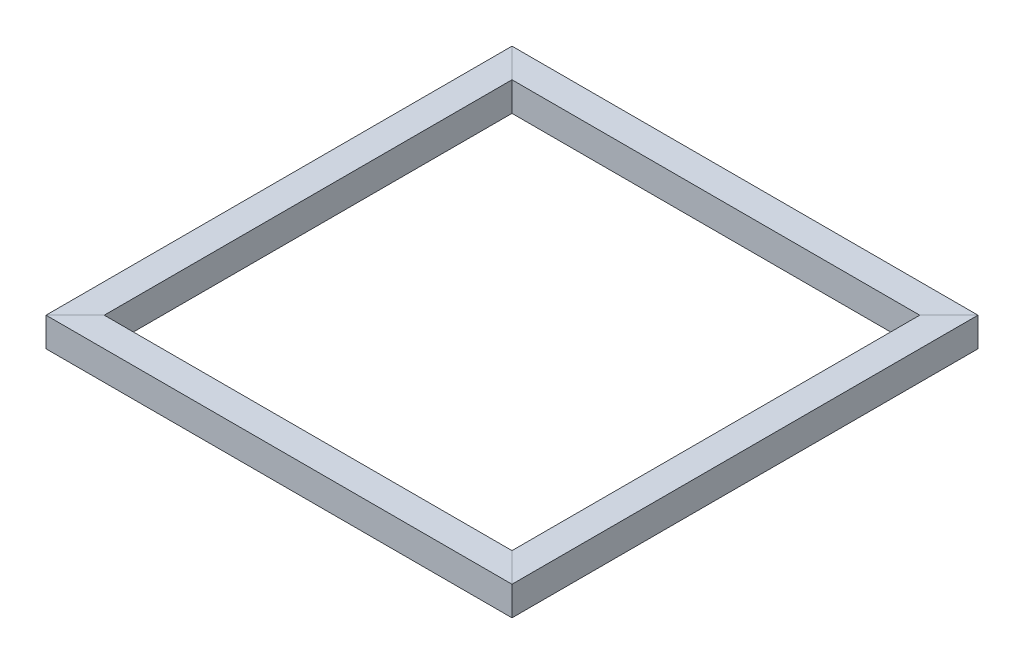
ISO-10303-21;
HEADER;
FILE_DESCRIPTION(('STEP AP214'),'2;1');
FILE_NAME('part.step','',(''),(''),'','','');
FILE_SCHEMA(('AUTOMOTIVE_DESIGN { 1 0 10303 214 1 1 1 1 }'));
ENDSEC;
DATA;
#1=APPLICATION_CONTEXT('core data for automotive mechanical design processes');
#2=APPLICATION_PROTOCOL_DEFINITION('international standard','automotive_design',2000,#1);
#3=PRODUCT_CONTEXT('',#1,'mechanical');
#4=PRODUCT('Part','Part','',(#3));
#5=PRODUCT_RELATED_PRODUCT_CATEGORY('part','',(#4));
#6=PRODUCT_DEFINITION_FORMATION('','',#4);
#7=PRODUCT_DEFINITION_CONTEXT('part definition',#1,'design');
#8=PRODUCT_DEFINITION('design','',#6,#7);
#9=PRODUCT_DEFINITION_SHAPE('','',#8);
#10=(LENGTH_UNIT() NAMED_UNIT(*) SI_UNIT(.MILLI.,.METRE.));
#11=(NAMED_UNIT(*) PLANE_ANGLE_UNIT() SI_UNIT($,.RADIAN.));
#12=(NAMED_UNIT(*) SI_UNIT($,.STERADIAN.) SOLID_ANGLE_UNIT());
#13=UNCERTAINTY_MEASURE_WITH_UNIT(LENGTH_MEASURE(1.E-05),#10,'distance_accuracy_value','');
#14=(GEOMETRIC_REPRESENTATION_CONTEXT(3) GLOBAL_UNCERTAINTY_ASSIGNED_CONTEXT((#13)) GLOBAL_UNIT_ASSIGNED_CONTEXT((#10,
#11,#12)) REPRESENTATION_CONTEXT('',''));
#15=CARTESIAN_POINT('',(0.,0.,0.));
#16=DIRECTION('',(0.,0.,1.));
#17=DIRECTION('',(1.,0.,0.));
#18=AXIS2_PLACEMENT_3D('',#15,#16,#17);
#19=CARTESIAN_POINT('',(-160.,10.,150.));
#20=DIRECTION('',(1.,0.,0.));
#21=DIRECTION('',(0.,0.,-1.));
#22=AXIS2_PLACEMENT_3D('',#19,#20,#21);
#23=PLANE('',#22);
#24=DIRECTION('',(0.,1.,0.));
#25=VECTOR('',#24,1.);
#26=CARTESIAN_POINT('',(-160.,10.,-160.));
#27=LINE('',#26,#25);
#28=CARTESIAN_POINT('',(-160.,-10.,-160.));
#29=VERTEX_POINT('',#28);
#30=CARTESIAN_POINT('',(-160.,10.,-160.));
#31=VERTEX_POINT('',#30);
#32=EDGE_CURVE('E141',#29,#31,#27,.T.);
#33=ORIENTED_EDGE('',*,*,#32,.F.);
#34=DIRECTION('',(0.,0.,-1.));
#35=VECTOR('',#34,1.);
#36=CARTESIAN_POINT('',(-160.,-10.,150.));
#37=LINE('',#36,#35);
#38=CARTESIAN_POINT('',(-160.,-10.,160.));
#39=VERTEX_POINT('',#38);
#40=EDGE_CURVE('E78',#39,#29,#37,.T.);
#41=ORIENTED_EDGE('',*,*,#40,.F.);
#42=DIRECTION('',(0.,-1.,0.));
#43=VECTOR('',#42,1.);
#44=CARTESIAN_POINT('',(-160.,10.,160.));
#45=LINE('',#44,#43);
#46=CARTESIAN_POINT('',(-160.,10.,160.));
#47=VERTEX_POINT('',#46);
#48=EDGE_CURVE('E153',#47,#39,#45,.T.);
#49=ORIENTED_EDGE('',*,*,#48,.F.);
#50=DIRECTION('',(0.,0.,-1.));
#51=VECTOR('',#50,1.);
#52=CARTESIAN_POINT('',(-160.,10.,150.));
#53=LINE('',#52,#51);
#54=EDGE_CURVE('E160',#47,#31,#53,.T.);
#55=ORIENTED_EDGE('',*,*,#54,.T.);
#56=EDGE_LOOP('',(#33,#41,#49,#55));
#57=FACE_BOUND('',#56,.T.);
#58=ADVANCED_FACE('F64',(#57),#23,.F.);
#59=CARTESIAN_POINT('',(-140.,-10.,150.));
#60=DIRECTION('',(0.,1.,0.));
#61=DIRECTION('',(-1.,0.,0.));
#62=AXIS2_PLACEMENT_3D('',#59,#60,#61);
#63=PLANE('',#62);
#64=DIRECTION('',(-0.707106781186547,0.,-0.707106781186548));
#65=VECTOR('',#64,1.);
#66=CARTESIAN_POINT('',(4.99999999999987,-9.99999999999997,5.00000000000003));
#67=LINE('',#66,#65);
#68=CARTESIAN_POINT('',(-140.,-10.,-140.));
#69=VERTEX_POINT('',#68);
#70=EDGE_CURVE('E183',#69,#29,#67,.T.);
#71=ORIENTED_EDGE('',*,*,#70,.F.);
#72=DIRECTION('',(0.,0.,-1.));
#73=VECTOR('',#72,1.);
#74=CARTESIAN_POINT('',(-140.,-10.,150.));
#75=LINE('',#74,#73);
#76=CARTESIAN_POINT('',(-140.,-10.,140.));
#77=VERTEX_POINT('',#76);
#78=EDGE_CURVE('E150',#77,#69,#75,.T.);
#79=ORIENTED_EDGE('',*,*,#78,.F.);
#80=DIRECTION('',(0.707106781186548,0.,-0.707106781186547));
#81=VECTOR('',#80,1.);
#82=CARTESIAN_POINT('',(-145.,-10.,145.));
#83=LINE('',#82,#81);
#84=EDGE_CURVE('E198',#39,#77,#83,.T.);
#85=ORIENTED_EDGE('',*,*,#84,.F.);
#86=ORIENTED_EDGE('',*,*,#40,.T.);
#87=EDGE_LOOP('',(#71,#79,#85,#86));
#88=FACE_BOUND('',#87,.T.);
#89=ADVANCED_FACE('F206',(#88),#63,.F.);
#90=CARTESIAN_POINT('',(-140.,10.,150.));
#91=DIRECTION('',(-1.,0.,0.));
#92=DIRECTION('',(0.,0.,1.));
#93=AXIS2_PLACEMENT_3D('',#90,#91,#92);
#94=PLANE('',#93);
#95=DIRECTION('',(0.,-1.,0.));
#96=VECTOR('',#95,1.);
#97=CARTESIAN_POINT('',(-140.,10.,-140.));
#98=LINE('',#97,#96);
#99=CARTESIAN_POINT('',(-140.,10.,-140.));
#100=VERTEX_POINT('',#99);
#101=EDGE_CURVE('E186',#100,#69,#98,.T.);
#102=ORIENTED_EDGE('',*,*,#101,.F.);
#103=DIRECTION('',(0.,0.,-1.));
#104=VECTOR('',#103,1.);
#105=CARTESIAN_POINT('',(-140.,10.,150.));
#106=LINE('',#105,#104);
#107=CARTESIAN_POINT('',(-140.,10.,140.));
#108=VERTEX_POINT('',#107);
#109=EDGE_CURVE('E162',#108,#100,#106,.T.);
#110=ORIENTED_EDGE('',*,*,#109,.F.);
#111=DIRECTION('',(0.,1.,0.));
#112=VECTOR('',#111,1.);
#113=CARTESIAN_POINT('',(-140.,10.,140.));
#114=LINE('',#113,#112);
#115=EDGE_CURVE('E196',#77,#108,#114,.T.);
#116=ORIENTED_EDGE('',*,*,#115,.F.);
#117=ORIENTED_EDGE('',*,*,#78,.T.);
#118=EDGE_LOOP('',(#102,#110,#116,#117));
#119=FACE_BOUND('',#118,.T.);
#120=ADVANCED_FACE('F208',(#119),#94,.F.);
#121=CARTESIAN_POINT('',(-140.,10.,150.));
#122=DIRECTION('',(0.,-1.,0.));
#123=DIRECTION('',(1.,0.,0.));
#124=AXIS2_PLACEMENT_3D('',#121,#122,#123);
#125=PLANE('',#124);
#126=DIRECTION('',(0.707106781186547,0.,0.707106781186548));
#127=VECTOR('',#126,1.);
#128=CARTESIAN_POINT('',(4.99999999999995,10.,5.00000000000003));
#129=LINE('',#128,#127);
#130=EDGE_CURVE('E175',#31,#100,#129,.T.);
#131=ORIENTED_EDGE('',*,*,#130,.F.);
#132=ORIENTED_EDGE('',*,*,#54,.F.);
#133=DIRECTION('',(-0.707106781186548,0.,0.707106781186547));
#134=VECTOR('',#133,1.);
#135=CARTESIAN_POINT('',(-145.,10.,145.));
#136=LINE('',#135,#134);
#137=EDGE_CURVE('E193',#108,#47,#136,.T.);
#138=ORIENTED_EDGE('',*,*,#137,.F.);
#139=ORIENTED_EDGE('',*,*,#109,.T.);
#140=EDGE_LOOP('',(#131,#132,#138,#139));
#141=FACE_BOUND('',#140,.T.);
#142=ADVANCED_FACE('F210',(#141),#125,.F.);
#143=CARTESIAN_POINT('',(-150.,0.,150.));
#144=DIRECTION('',(0.707106781186547,0.,0.707106781186548));
#145=DIRECTION('',(0.707106781186548,0.,-0.707106781186547));
#146=AXIS2_PLACEMENT_3D('',#143,#144,#145);
#147=PLANE('',#146);
#148=DIRECTION('',(0.,1.,0.));
#149=VECTOR('',#148,1.);
#150=CARTESIAN_POINT('',(-142.,8.,142.));
#151=LINE('',#150,#149);
#152=CARTESIAN_POINT('',(-142.,-8.,142.));
#153=VERTEX_POINT('',#152);
#154=CARTESIAN_POINT('',(-142.,8.,142.));
#155=VERTEX_POINT('',#154);
#156=EDGE_CURVE('E146',#153,#155,#151,.T.);
#157=ORIENTED_EDGE('',*,*,#156,.F.);
#158=DIRECTION('',(0.707106781186548,0.,-0.707106781186547));
#159=VECTOR('',#158,1.);
#160=CARTESIAN_POINT('',(-154.,-8.,154.));
#161=LINE('',#160,#159);
#162=CARTESIAN_POINT('',(-158.,-8.,158.));
#163=VERTEX_POINT('',#162);
#164=EDGE_CURVE('E172',#163,#153,#161,.T.);
#165=ORIENTED_EDGE('',*,*,#164,.F.);
#166=DIRECTION('',(0.,-1.,0.));
#167=VECTOR('',#166,1.);
#168=CARTESIAN_POINT('',(-158.,8.,158.));
#169=LINE('',#168,#167);
#170=CARTESIAN_POINT('',(-158.,8.,158.));
#171=VERTEX_POINT('',#170);
#172=EDGE_CURVE('E170',#171,#163,#169,.T.);
#173=ORIENTED_EDGE('',*,*,#172,.F.);
#174=DIRECTION('',(-0.707106781186548,0.,0.707106781186547));
#175=VECTOR('',#174,1.);
#176=CARTESIAN_POINT('',(-154.,8.,154.));
#177=LINE('',#176,#175);
#178=EDGE_CURVE('E71',#155,#171,#177,.T.);
#179=ORIENTED_EDGE('',*,*,#178,.F.);
#180=EDGE_LOOP('',(#157,#165,#173,#179));
#181=FACE_BOUND('',#180,.T.);
#182=ORIENTED_EDGE('',*,*,#137,.T.);
#183=ORIENTED_EDGE('',*,*,#48,.T.);
#184=ORIENTED_EDGE('',*,*,#84,.T.);
#185=ORIENTED_EDGE('',*,*,#115,.T.);
#186=EDGE_LOOP('',(#182,#183,#184,#185));
#187=FACE_BOUND('',#186,.T.);
#188=ADVANCED_FACE('F167',(#181,#187),#147,.T.);
#189=CARTESIAN_POINT('',(-142.,8.,150.));
#190=DIRECTION('',(-1.,0.,0.));
#191=DIRECTION('',(0.,0.,1.));
#192=AXIS2_PLACEMENT_3D('',#189,#190,#191);
#193=PLANE('',#192);
#194=DIRECTION('',(0.,0.,-1.));
#195=VECTOR('',#194,1.);
#196=CARTESIAN_POINT('',(-142.,8.,150.));
#197=LINE('',#196,#195);
#198=CARTESIAN_POINT('',(-142.,8.,-142.));
#199=VERTEX_POINT('',#198);
#200=EDGE_CURVE('E137',#155,#199,#197,.T.);
#201=ORIENTED_EDGE('',*,*,#200,.T.);
#202=DIRECTION('',(0.,-1.,0.));
#203=VECTOR('',#202,1.);
#204=CARTESIAN_POINT('',(-142.,8.,-142.));
#205=LINE('',#204,#203);
#206=CARTESIAN_POINT('',(-142.,-8.,-142.));
#207=VERTEX_POINT('',#206);
#208=EDGE_CURVE('E13',#199,#207,#205,.T.);
#209=ORIENTED_EDGE('',*,*,#208,.T.);
#210=DIRECTION('',(0.,0.,-1.));
#211=VECTOR('',#210,1.);
#212=CARTESIAN_POINT('',(-142.,-8.,150.));
#213=LINE('',#212,#211);
#214=EDGE_CURVE('E158',#153,#207,#213,.T.);
#215=ORIENTED_EDGE('',*,*,#214,.F.);
#216=ORIENTED_EDGE('',*,*,#156,.T.);
#217=EDGE_LOOP('',(#201,#209,#215,#216));
#218=FACE_BOUND('',#217,.T.);
#219=ADVANCED_FACE('F145',(#218),#193,.T.);
#220=CARTESIAN_POINT('',(-158.,-8.,150.));
#221=DIRECTION('',(0.,1.,0.));
#222=DIRECTION('',(0.,0.,1.));
#223=AXIS2_PLACEMENT_3D('',#220,#221,#222);
#224=PLANE('',#223);
#225=ORIENTED_EDGE('',*,*,#214,.T.);
#226=DIRECTION('',(-0.707106781186547,0.,-0.707106781186548));
#227=VECTOR('',#226,1.);
#228=CARTESIAN_POINT('',(-4.00000000000006,-8.,-4.));
#229=LINE('',#228,#227);
#230=CARTESIAN_POINT('',(-158.,-8.,-158.));
#231=VERTEX_POINT('',#230);
#232=EDGE_CURVE('E86',#207,#231,#229,.T.);
#233=ORIENTED_EDGE('',*,*,#232,.T.);
#234=DIRECTION('',(0.,0.,-1.));
#235=VECTOR('',#234,1.);
#236=CARTESIAN_POINT('',(-158.,-8.,150.));
#237=LINE('',#236,#235);
#238=EDGE_CURVE('E148',#163,#231,#237,.T.);
#239=ORIENTED_EDGE('',*,*,#238,.F.);
#240=ORIENTED_EDGE('',*,*,#164,.T.);
#241=EDGE_LOOP('',(#225,#233,#239,#240));
#242=FACE_BOUND('',#241,.T.);
#243=ADVANCED_FACE('F252',(#242),#224,.T.);
#244=CARTESIAN_POINT('',(-158.,8.,150.));
#245=DIRECTION('',(1.,0.,0.));
#246=DIRECTION('',(0.,0.,-1.));
#247=AXIS2_PLACEMENT_3D('',#244,#245,#246);
#248=PLANE('',#247);
#249=ORIENTED_EDGE('',*,*,#238,.T.);
#250=DIRECTION('',(0.,1.,0.));
#251=VECTOR('',#250,1.);
#252=CARTESIAN_POINT('',(-158.,8.,-158.));
#253=LINE('',#252,#251);
#254=CARTESIAN_POINT('',(-158.,8.,-158.));
#255=VERTEX_POINT('',#254);
#256=EDGE_CURVE('E142',#231,#255,#253,.T.);
#257=ORIENTED_EDGE('',*,*,#256,.T.);
#258=DIRECTION('',(0.,0.,-1.));
#259=VECTOR('',#258,1.);
#260=CARTESIAN_POINT('',(-158.,8.,150.));
#261=LINE('',#260,#259);
#262=EDGE_CURVE('E139',#171,#255,#261,.T.);
#263=ORIENTED_EDGE('',*,*,#262,.F.);
#264=ORIENTED_EDGE('',*,*,#172,.T.);
#265=EDGE_LOOP('',(#249,#257,#263,#264));
#266=FACE_BOUND('',#265,.T.);
#267=ADVANCED_FACE('F177',(#266),#248,.T.);
#268=CARTESIAN_POINT('',(-158.,8.,150.));
#269=DIRECTION('',(0.,-1.,0.));
#270=DIRECTION('',(0.,0.,-1.));
#271=AXIS2_PLACEMENT_3D('',#268,#269,#270);
#272=PLANE('',#271);
#273=ORIENTED_EDGE('',*,*,#262,.T.);
#274=DIRECTION('',(0.707106781186547,0.,0.707106781186548));
#275=VECTOR('',#274,1.);
#276=CARTESIAN_POINT('',(-4.00000000000006,8.,-4.));
#277=LINE('',#276,#275);
#278=EDGE_CURVE('E128',#255,#199,#277,.T.);
#279=ORIENTED_EDGE('',*,*,#278,.T.);
#280=ORIENTED_EDGE('',*,*,#200,.F.);
#281=ORIENTED_EDGE('',*,*,#178,.T.);
#282=EDGE_LOOP('',(#273,#279,#280,#281));
#283=FACE_BOUND('',#282,.T.);
#284=ADVANCED_FACE('F135',(#283),#272,.T.);
#285=CARTESIAN_POINT('',(-150.,0.,-150.));
#286=DIRECTION('',(0.707106781186548,0.,-0.707106781186547));
#287=DIRECTION('',(-0.707106781186547,0.,-0.707106781186548));
#288=AXIS2_PLACEMENT_3D('',#285,#286,#287);
#289=PLANE('',#288);
#290=ORIENTED_EDGE('',*,*,#278,.F.);
#291=ORIENTED_EDGE('',*,*,#256,.F.);
#292=ORIENTED_EDGE('',*,*,#232,.F.);
#293=ORIENTED_EDGE('',*,*,#208,.F.);
#294=EDGE_LOOP('',(#290,#291,#292,#293));
#295=FACE_BOUND('',#294,.T.);
#296=ORIENTED_EDGE('',*,*,#32,.T.);
#297=ORIENTED_EDGE('',*,*,#130,.T.);
#298=ORIENTED_EDGE('',*,*,#101,.T.);
#299=ORIENTED_EDGE('',*,*,#70,.T.);
#300=EDGE_LOOP('',(#296,#297,#298,#299));
#301=FACE_BOUND('',#300,.T.);
#302=ADVANCED_FACE('F126',(#295,#301),#289,.T.);
#303=CLOSED_SHELL('',(#58,#89,#120,#142,#188,#219,#243,#267,#284,#302));
#304=MANIFOLD_SOLID_BREP('B2',#303);
#305=CARTESIAN_POINT('',(-150.,10.,-160.));
#306=DIRECTION('',(0.,0.,1.));
#307=DIRECTION('',(1.,0.,0.));
#308=AXIS2_PLACEMENT_3D('',#305,#306,#307);
#309=PLANE('',#308);
#310=DIRECTION('',(0.,-1.,0.));
#311=VECTOR('',#310,1.);
#312=CARTESIAN_POINT('',(-160.,10.,-160.));
#313=LINE('',#312,#311);
#314=CARTESIAN_POINT('',(-160.,10.,-160.));
#315=VERTEX_POINT('',#314);
#316=CARTESIAN_POINT('',(-160.,-10.,-160.));
#317=VERTEX_POINT('',#316);
#318=EDGE_CURVE('E467',#315,#317,#313,.T.);
#319=ORIENTED_EDGE('',*,*,#318,.F.);
#320=DIRECTION('',(1.,0.,0.));
#321=VECTOR('',#320,1.);
#322=CARTESIAN_POINT('',(-150.,10.,-160.));
#323=LINE('',#322,#321);
#324=CARTESIAN_POINT('',(160.,10.,-160.));
#325=VERTEX_POINT('',#324);
#326=EDGE_CURVE('E354',#315,#325,#323,.T.);
#327=ORIENTED_EDGE('',*,*,#326,.T.);
#328=DIRECTION('',(0.,1.,0.));
#329=VECTOR('',#328,1.);
#330=CARTESIAN_POINT('',(160.,10.,-160.));
#331=LINE('',#330,#329);
#332=CARTESIAN_POINT('',(160.,-10.,-160.));
#333=VERTEX_POINT('',#332);
#334=EDGE_CURVE('E429',#333,#325,#331,.T.);
#335=ORIENTED_EDGE('',*,*,#334,.F.);
#336=DIRECTION('',(1.,0.,0.));
#337=VECTOR('',#336,1.);
#338=CARTESIAN_POINT('',(-150.,-10.,-160.));
#339=LINE('',#338,#337);
#340=EDGE_CURVE('E433',#317,#333,#339,.T.);
#341=ORIENTED_EDGE('',*,*,#340,.F.);
#342=EDGE_LOOP('',(#319,#327,#335,#341));
#343=FACE_BOUND('',#342,.T.);
#344=ADVANCED_FACE('F340',(#343),#309,.F.);
#345=CARTESIAN_POINT('',(-150.,-10.,-140.));
#346=DIRECTION('',(0.,1.,0.));
#347=DIRECTION('',(0.,0.,1.));
#348=AXIS2_PLACEMENT_3D('',#345,#346,#347);
#349=PLANE('',#348);
#350=DIRECTION('',(0.707106781186547,0.,0.707106781186548));
#351=VECTOR('',#350,1.);
#352=CARTESIAN_POINT('',(-145.,-10.,-145.));
#353=LINE('',#352,#351);
#354=CARTESIAN_POINT('',(-140.,-10.,-140.));
#355=VERTEX_POINT('',#354);
#356=EDGE_CURVE('E464',#317,#355,#353,.T.);
#357=ORIENTED_EDGE('',*,*,#356,.F.);
#358=ORIENTED_EDGE('',*,*,#340,.T.);
#359=DIRECTION('',(0.707106781186548,0.,-0.707106781186547));
#360=VECTOR('',#359,1.);
#361=CARTESIAN_POINT('',(-5.00000000000009,-9.99999999999998,4.99999999999981));
#362=LINE('',#361,#360);
#363=CARTESIAN_POINT('',(140.,-10.,-140.));
#364=VERTEX_POINT('',#363);
#365=EDGE_CURVE('E443',#364,#333,#362,.T.);
#366=ORIENTED_EDGE('',*,*,#365,.F.);
#367=DIRECTION('',(1.,0.,0.));
#368=VECTOR('',#367,1.);
#369=CARTESIAN_POINT('',(-150.,-10.,-140.));
#370=LINE('',#369,#368);
#371=EDGE_CURVE('E431',#355,#364,#370,.T.);
#372=ORIENTED_EDGE('',*,*,#371,.F.);
#373=EDGE_LOOP('',(#357,#358,#366,#372));
#374=FACE_BOUND('',#373,.T.);
#375=ADVANCED_FACE('F486',(#374),#349,.F.);
#376=CARTESIAN_POINT('',(-150.,10.,-140.));
#377=DIRECTION('',(0.,0.,-1.));
#378=DIRECTION('',(-1.,0.,0.));
#379=AXIS2_PLACEMENT_3D('',#376,#377,#378);
#380=PLANE('',#379);
#381=DIRECTION('',(0.,1.,0.));
#382=VECTOR('',#381,1.);
#383=CARTESIAN_POINT('',(-140.,10.,-140.));
#384=LINE('',#383,#382);
#385=CARTESIAN_POINT('',(-140.,10.,-140.));
#386=VERTEX_POINT('',#385);
#387=EDGE_CURVE('E461',#355,#386,#384,.T.);
#388=ORIENTED_EDGE('',*,*,#387,.F.);
#389=ORIENTED_EDGE('',*,*,#371,.T.);
#390=DIRECTION('',(0.,-1.,0.));
#391=VECTOR('',#390,1.);
#392=CARTESIAN_POINT('',(140.,10.,-140.));
#393=LINE('',#392,#391);
#394=CARTESIAN_POINT('',(140.,10.,-140.));
#395=VERTEX_POINT('',#394);
#396=EDGE_CURVE('E446',#395,#364,#393,.T.);
#397=ORIENTED_EDGE('',*,*,#396,.F.);
#398=DIRECTION('',(1.,0.,0.));
#399=VECTOR('',#398,1.);
#400=CARTESIAN_POINT('',(-150.,10.,-140.));
#401=LINE('',#400,#399);
#402=EDGE_CURVE('E428',#386,#395,#401,.T.);
#403=ORIENTED_EDGE('',*,*,#402,.F.);
#404=EDGE_LOOP('',(#388,#389,#397,#403));
#405=FACE_BOUND('',#404,.T.);
#406=ADVANCED_FACE('F490',(#405),#380,.F.);
#407=CARTESIAN_POINT('',(-150.,10.,-140.));
#408=DIRECTION('',(0.,-1.,0.));
#409=DIRECTION('',(0.,0.,-1.));
#410=AXIS2_PLACEMENT_3D('',#407,#408,#409);
#411=PLANE('',#410);
#412=DIRECTION('',(-0.707106781186547,0.,-0.707106781186548));
#413=VECTOR('',#412,1.);
#414=CARTESIAN_POINT('',(-145.,10.,-145.));
#415=LINE('',#414,#413);
#416=EDGE_CURVE('E458',#386,#315,#415,.T.);
#417=ORIENTED_EDGE('',*,*,#416,.F.);
#418=ORIENTED_EDGE('',*,*,#402,.T.);
#419=DIRECTION('',(-0.707106781186548,0.,0.707106781186547));
#420=VECTOR('',#419,1.);
#421=CARTESIAN_POINT('',(-5.00000000000009,10.,4.99999999999981));
#422=LINE('',#421,#420);
#423=EDGE_CURVE('E449',#325,#395,#422,.T.);
#424=ORIENTED_EDGE('',*,*,#423,.F.);
#425=ORIENTED_EDGE('',*,*,#326,.F.);
#426=EDGE_LOOP('',(#417,#418,#424,#425));
#427=FACE_BOUND('',#426,.T.);
#428=ADVANCED_FACE('F482',(#427),#411,.F.);
#429=CARTESIAN_POINT('',(150.,0.,-150.));
#430=DIRECTION('',(0.707106781186547,0.,0.707106781186548));
#431=DIRECTION('',(0.707106781186548,0.,-0.707106781186547));
#432=AXIS2_PLACEMENT_3D('',#429,#430,#431);
#433=PLANE('',#432);
#434=DIRECTION('',(0.,-1.,0.));
#435=VECTOR('',#434,1.);
#436=CARTESIAN_POINT('',(142.,8.,-142.));
#437=LINE('',#436,#435);
#438=CARTESIAN_POINT('',(142.,8.,-142.));
#439=VERTEX_POINT('',#438);
#440=CARTESIAN_POINT('',(142.,-8.,-142.));
#441=VERTEX_POINT('',#440);
#442=EDGE_CURVE('E420',#439,#441,#437,.T.);
#443=ORIENTED_EDGE('',*,*,#442,.F.);
#444=DIRECTION('',(-0.707106781186548,0.,0.707106781186547));
#445=VECTOR('',#444,1.);
#446=CARTESIAN_POINT('',(3.99999999999992,8.,-4.00000000000017));
#447=LINE('',#446,#445);
#448=CARTESIAN_POINT('',(158.,8.,-158.));
#449=VERTEX_POINT('',#448);
#450=EDGE_CURVE('E347',#449,#439,#447,.T.);
#451=ORIENTED_EDGE('',*,*,#450,.F.);
#452=DIRECTION('',(0.,1.,0.));
#453=VECTOR('',#452,1.);
#454=CARTESIAN_POINT('',(158.,8.,-158.));
#455=LINE('',#454,#453);
#456=CARTESIAN_POINT('',(158.,-8.,-158.));
#457=VERTEX_POINT('',#456);
#458=EDGE_CURVE('E455',#457,#449,#455,.T.);
#459=ORIENTED_EDGE('',*,*,#458,.F.);
#460=DIRECTION('',(0.707106781186548,0.,-0.707106781186547));
#461=VECTOR('',#460,1.);
#462=CARTESIAN_POINT('',(3.99999999999992,-8.,-4.00000000000017));
#463=LINE('',#462,#461);
#464=EDGE_CURVE('E453',#441,#457,#463,.T.);
#465=ORIENTED_EDGE('',*,*,#464,.F.);
#466=EDGE_LOOP('',(#443,#451,#459,#465));
#467=FACE_BOUND('',#466,.T.);
#468=ORIENTED_EDGE('',*,*,#365,.T.);
#469=ORIENTED_EDGE('',*,*,#334,.T.);
#470=ORIENTED_EDGE('',*,*,#423,.T.);
#471=ORIENTED_EDGE('',*,*,#396,.T.);
#472=EDGE_LOOP('',(#468,#469,#470,#471));
#473=FACE_BOUND('',#472,.T.);
#474=ADVANCED_FACE('F479',(#467,#473),#433,.T.);
#475=CARTESIAN_POINT('',(-150.,8.,-142.));
#476=DIRECTION('',(0.,0.,-1.));
#477=DIRECTION('',(-1.,0.,0.));
#478=AXIS2_PLACEMENT_3D('',#475,#476,#477);
#479=PLANE('',#478);
#480=DIRECTION('',(1.,0.,0.));
#481=VECTOR('',#480,1.);
#482=CARTESIAN_POINT('',(-150.,-8.,-142.));
#483=LINE('',#482,#481);
#484=CARTESIAN_POINT('',(-142.,-8.,-142.));
#485=VERTEX_POINT('',#484);
#486=EDGE_CURVE('E411',#485,#441,#483,.T.);
#487=ORIENTED_EDGE('',*,*,#486,.F.);
#488=DIRECTION('',(0.,1.,0.));
#489=VECTOR('',#488,1.);
#490=CARTESIAN_POINT('',(-142.,8.,-142.));
#491=LINE('',#490,#489);
#492=CARTESIAN_POINT('',(-142.,8.,-142.));
#493=VERTEX_POINT('',#492);
#494=EDGE_CURVE('E62',#485,#493,#491,.T.);
#495=ORIENTED_EDGE('',*,*,#494,.T.);
#496=DIRECTION('',(1.,0.,0.));
#497=VECTOR('',#496,1.);
#498=CARTESIAN_POINT('',(-150.,8.,-142.));
#499=LINE('',#498,#497);
#500=EDGE_CURVE('E434',#493,#439,#499,.T.);
#501=ORIENTED_EDGE('',*,*,#500,.T.);
#502=ORIENTED_EDGE('',*,*,#442,.T.);
#503=EDGE_LOOP('',(#487,#495,#501,#502));
#504=FACE_BOUND('',#503,.T.);
#505=ADVANCED_FACE('F418',(#504),#479,.T.);
#506=CARTESIAN_POINT('',(-150.,-8.,-158.));
#507=DIRECTION('',(0.,1.,0.));
#508=DIRECTION('',(0.,0.,1.));
#509=AXIS2_PLACEMENT_3D('',#506,#507,#508);
#510=PLANE('',#509);
#511=DIRECTION('',(1.,0.,0.));
#512=VECTOR('',#511,1.);
#513=CARTESIAN_POINT('',(-150.,-8.,-158.));
#514=LINE('',#513,#512);
#515=CARTESIAN_POINT('',(-158.,-8.,-158.));
#516=VERTEX_POINT('',#515);
#517=EDGE_CURVE('E413',#516,#457,#514,.T.);
#518=ORIENTED_EDGE('',*,*,#517,.F.);
#519=DIRECTION('',(0.707106781186547,0.,0.707106781186548));
#520=VECTOR('',#519,1.);
#521=CARTESIAN_POINT('',(-154.,-8.,-154.));
#522=LINE('',#521,#520);
#523=EDGE_CURVE('E404',#516,#485,#522,.T.);
#524=ORIENTED_EDGE('',*,*,#523,.T.);
#525=ORIENTED_EDGE('',*,*,#486,.T.);
#526=ORIENTED_EDGE('',*,*,#464,.T.);
#527=EDGE_LOOP('',(#518,#524,#525,#526));
#528=FACE_BOUND('',#527,.T.);
#529=ADVANCED_FACE('F409',(#528),#510,.T.);
#530=CARTESIAN_POINT('',(-150.,8.,-158.));
#531=DIRECTION('',(0.,0.,1.));
#532=DIRECTION('',(1.,0.,0.));
#533=AXIS2_PLACEMENT_3D('',#530,#531,#532);
#534=PLANE('',#533);
#535=DIRECTION('',(1.,0.,0.));
#536=VECTOR('',#535,1.);
#537=CARTESIAN_POINT('',(-150.,8.,-158.));
#538=LINE('',#537,#536);
#539=CARTESIAN_POINT('',(-158.,8.,-158.));
#540=VERTEX_POINT('',#539);
#541=EDGE_CURVE('E423',#540,#449,#538,.T.);
#542=ORIENTED_EDGE('',*,*,#541,.F.);
#543=DIRECTION('',(0.,-1.,0.));
#544=VECTOR('',#543,1.);
#545=CARTESIAN_POINT('',(-158.,8.,-158.));
#546=LINE('',#545,#544);
#547=EDGE_CURVE('E415',#540,#516,#546,.T.);
#548=ORIENTED_EDGE('',*,*,#547,.T.);
#549=ORIENTED_EDGE('',*,*,#517,.T.);
#550=ORIENTED_EDGE('',*,*,#458,.T.);
#551=EDGE_LOOP('',(#542,#548,#549,#550));
#552=FACE_BOUND('',#551,.T.);
#553=ADVANCED_FACE('F473',(#552),#534,.T.);
#554=CARTESIAN_POINT('',(-150.,8.,-158.));
#555=DIRECTION('',(0.,-1.,0.));
#556=DIRECTION('',(0.,0.,-1.));
#557=AXIS2_PLACEMENT_3D('',#554,#555,#556);
#558=PLANE('',#557);
#559=ORIENTED_EDGE('',*,*,#500,.F.);
#560=DIRECTION('',(-0.707106781186547,0.,-0.707106781186548));
#561=VECTOR('',#560,1.);
#562=CARTESIAN_POINT('',(-154.,8.,-154.));
#563=LINE('',#562,#561);
#564=EDGE_CURVE('E362',#493,#540,#563,.T.);
#565=ORIENTED_EDGE('',*,*,#564,.T.);
#566=ORIENTED_EDGE('',*,*,#541,.T.);
#567=ORIENTED_EDGE('',*,*,#450,.T.);
#568=EDGE_LOOP('',(#559,#565,#566,#567));
#569=FACE_BOUND('',#568,.T.);
#570=ADVANCED_FACE('F477',(#569),#558,.T.);
#571=CARTESIAN_POINT('',(-150.,0.,-150.));
#572=DIRECTION('',(-0.707106781186548,0.,0.707106781186547));
#573=DIRECTION('',(0.707106781186547,0.,0.707106781186548));
#574=AXIS2_PLACEMENT_3D('',#571,#572,#573);
#575=PLANE('',#574);
#576=ORIENTED_EDGE('',*,*,#564,.F.);
#577=ORIENTED_EDGE('',*,*,#494,.F.);
#578=ORIENTED_EDGE('',*,*,#523,.F.);
#579=ORIENTED_EDGE('',*,*,#547,.F.);
#580=EDGE_LOOP('',(#576,#577,#578,#579));
#581=FACE_BOUND('',#580,.T.);
#582=ORIENTED_EDGE('',*,*,#387,.T.);
#583=ORIENTED_EDGE('',*,*,#416,.T.);
#584=ORIENTED_EDGE('',*,*,#318,.T.);
#585=ORIENTED_EDGE('',*,*,#356,.T.);
#586=EDGE_LOOP('',(#582,#583,#584,#585));
#587=FACE_BOUND('',#586,.T.);
#588=ADVANCED_FACE('F402',(#581,#587),#575,.T.);
#589=CLOSED_SHELL('',(#344,#375,#406,#428,#474,#505,#529,#553,#570,#588));
#590=MANIFOLD_SOLID_BREP('B7',#589);
#591=CARTESIAN_POINT('',(150.,10.,160.));
#592=DIRECTION('',(0.,0.,-1.));
#593=DIRECTION('',(-1.,0.,0.));
#594=AXIS2_PLACEMENT_3D('',#591,#592,#593);
#595=PLANE('',#594);
#596=DIRECTION('',(0.,1.,0.));
#597=VECTOR('',#596,1.);
#598=CARTESIAN_POINT('',(-160.,10.,160.));
#599=LINE('',#598,#597);
#600=CARTESIAN_POINT('',(-160.,-10.,160.));
#601=VERTEX_POINT('',#600);
#602=CARTESIAN_POINT('',(-160.,10.,160.));
#603=VERTEX_POINT('',#602);
#604=EDGE_CURVE('E692',#601,#603,#599,.T.);
#605=ORIENTED_EDGE('',*,*,#604,.F.);
#606=DIRECTION('',(-1.,0.,0.));
#607=VECTOR('',#606,1.);
#608=CARTESIAN_POINT('',(150.,-10.,160.));
#609=LINE('',#608,#607);
#610=CARTESIAN_POINT('',(160.,-10.,160.));
#611=VERTEX_POINT('',#610);
#612=EDGE_CURVE('E629',#611,#601,#609,.T.);
#613=ORIENTED_EDGE('',*,*,#612,.F.);
#614=DIRECTION('',(0.,-1.,0.));
#615=VECTOR('',#614,1.);
#616=CARTESIAN_POINT('',(160.,10.,160.));
#617=LINE('',#616,#615);
#618=CARTESIAN_POINT('',(160.,10.,160.));
#619=VERTEX_POINT('',#618);
#620=EDGE_CURVE('E704',#619,#611,#617,.T.);
#621=ORIENTED_EDGE('',*,*,#620,.F.);
#622=DIRECTION('',(-1.,0.,0.));
#623=VECTOR('',#622,1.);
#624=CARTESIAN_POINT('',(150.,10.,160.));
#625=LINE('',#624,#623);
#626=EDGE_CURVE('E711',#619,#603,#625,.T.);
#627=ORIENTED_EDGE('',*,*,#626,.T.);
#628=EDGE_LOOP('',(#605,#613,#621,#627));
#629=FACE_BOUND('',#628,.T.);
#630=ADVANCED_FACE('F615',(#629),#595,.F.);
#631=CARTESIAN_POINT('',(150.,-10.,140.));
#632=DIRECTION('',(0.,1.,0.));
#633=DIRECTION('',(0.,0.,1.));
#634=AXIS2_PLACEMENT_3D('',#631,#632,#633);
#635=PLANE('',#634);
#636=DIRECTION('',(-0.707106781186548,0.,0.707106781186547));
#637=VECTOR('',#636,1.);
#638=CARTESIAN_POINT('',(4.99999999999989,-9.99999999999998,-5.));
#639=LINE('',#638,#637);
#640=CARTESIAN_POINT('',(-140.,-10.,140.));
#641=VERTEX_POINT('',#640);
#642=EDGE_CURVE('E734',#641,#601,#639,.T.);
#643=ORIENTED_EDGE('',*,*,#642,.F.);
#644=DIRECTION('',(-1.,0.,0.));
#645=VECTOR('',#644,1.);
#646=CARTESIAN_POINT('',(150.,-10.,140.));
#647=LINE('',#646,#645);
#648=CARTESIAN_POINT('',(140.,-10.,140.));
#649=VERTEX_POINT('',#648);
#650=EDGE_CURVE('E701',#649,#641,#647,.T.);
#651=ORIENTED_EDGE('',*,*,#650,.F.);
#652=DIRECTION('',(-0.707106781186547,0.,-0.707106781186548));
#653=VECTOR('',#652,1.);
#654=CARTESIAN_POINT('',(145.,-10.,145.));
#655=LINE('',#654,#653);
#656=EDGE_CURVE('E749',#611,#649,#655,.T.);
#657=ORIENTED_EDGE('',*,*,#656,.F.);
#658=ORIENTED_EDGE('',*,*,#612,.T.);
#659=EDGE_LOOP('',(#643,#651,#657,#658));
#660=FACE_BOUND('',#659,.T.);
#661=ADVANCED_FACE('F757',(#660),#635,.F.);
#662=CARTESIAN_POINT('',(150.,10.,140.));
#663=DIRECTION('',(0.,0.,1.));
#664=DIRECTION('',(1.,0.,0.));
#665=AXIS2_PLACEMENT_3D('',#662,#663,#664);
#666=PLANE('',#665);
#667=DIRECTION('',(0.,-1.,0.));
#668=VECTOR('',#667,1.);
#669=CARTESIAN_POINT('',(-140.,10.,140.));
#670=LINE('',#669,#668);
#671=CARTESIAN_POINT('',(-140.,10.,140.));
#672=VERTEX_POINT('',#671);
#673=EDGE_CURVE('E737',#672,#641,#670,.T.);
#674=ORIENTED_EDGE('',*,*,#673,.F.);
#675=DIRECTION('',(-1.,0.,0.));
#676=VECTOR('',#675,1.);
#677=CARTESIAN_POINT('',(150.,10.,140.));
#678=LINE('',#677,#676);
#679=CARTESIAN_POINT('',(140.,10.,140.));
#680=VERTEX_POINT('',#679);
#681=EDGE_CURVE('E713',#680,#672,#678,.T.);
#682=ORIENTED_EDGE('',*,*,#681,.F.);
#683=DIRECTION('',(0.,1.,0.));
#684=VECTOR('',#683,1.);
#685=CARTESIAN_POINT('',(140.,10.,140.));
#686=LINE('',#685,#684);
#687=EDGE_CURVE('E747',#649,#680,#686,.T.);
#688=ORIENTED_EDGE('',*,*,#687,.F.);
#689=ORIENTED_EDGE('',*,*,#650,.T.);
#690=EDGE_LOOP('',(#674,#682,#688,#689));
#691=FACE_BOUND('',#690,.T.);
#692=ADVANCED_FACE('F759',(#691),#666,.F.);
#693=CARTESIAN_POINT('',(150.,10.,140.));
#694=DIRECTION('',(0.,-1.,0.));
#695=DIRECTION('',(0.,0.,-1.));
#696=AXIS2_PLACEMENT_3D('',#693,#694,#695);
#697=PLANE('',#696);
#698=DIRECTION('',(0.707106781186548,0.,-0.707106781186547));
#699=VECTOR('',#698,1.);
#700=CARTESIAN_POINT('',(4.99999999999989,10.,-5.));
#701=LINE('',#700,#699);
#702=EDGE_CURVE('E726',#603,#672,#701,.T.);
#703=ORIENTED_EDGE('',*,*,#702,.F.);
#704=ORIENTED_EDGE('',*,*,#626,.F.);
#705=DIRECTION('',(0.707106781186547,0.,0.707106781186548));
#706=VECTOR('',#705,1.);
#707=CARTESIAN_POINT('',(145.,10.,145.));
#708=LINE('',#707,#706);
#709=EDGE_CURVE('E744',#680,#619,#708,.T.);
#710=ORIENTED_EDGE('',*,*,#709,.F.);
#711=ORIENTED_EDGE('',*,*,#681,.T.);
#712=EDGE_LOOP('',(#703,#704,#710,#711));
#713=FACE_BOUND('',#712,.T.);
#714=ADVANCED_FACE('F761',(#713),#697,.F.);
#715=CARTESIAN_POINT('',(150.,0.,150.));
#716=DIRECTION('',(0.707106781186548,0.,-0.707106781186547));
#717=DIRECTION('',(-0.707106781186547,0.,-0.707106781186548));
#718=AXIS2_PLACEMENT_3D('',#715,#716,#717);
#719=PLANE('',#718);
#720=DIRECTION('',(0.,1.,0.));
#721=VECTOR('',#720,1.);
#722=CARTESIAN_POINT('',(142.,8.,142.));
#723=LINE('',#722,#721);
#724=CARTESIAN_POINT('',(142.,-8.,142.));
#725=VERTEX_POINT('',#724);
#726=CARTESIAN_POINT('',(142.,8.,142.));
#727=VERTEX_POINT('',#726);
#728=EDGE_CURVE('E697',#725,#727,#723,.T.);
#729=ORIENTED_EDGE('',*,*,#728,.F.);
#730=DIRECTION('',(-0.707106781186547,0.,-0.707106781186548));
#731=VECTOR('',#730,1.);
#732=CARTESIAN_POINT('',(154.,-8.,154.));
#733=LINE('',#732,#731);
#734=CARTESIAN_POINT('',(158.,-8.,158.));
#735=VERTEX_POINT('',#734);
#736=EDGE_CURVE('E723',#735,#725,#733,.T.);
#737=ORIENTED_EDGE('',*,*,#736,.F.);
#738=DIRECTION('',(0.,-1.,0.));
#739=VECTOR('',#738,1.);
#740=CARTESIAN_POINT('',(158.,8.,158.));
#741=LINE('',#740,#739);
#742=CARTESIAN_POINT('',(158.,8.,158.));
#743=VERTEX_POINT('',#742);
#744=EDGE_CURVE('E721',#743,#735,#741,.T.);
#745=ORIENTED_EDGE('',*,*,#744,.F.);
#746=DIRECTION('',(0.707106781186547,0.,0.707106781186548));
#747=VECTOR('',#746,1.);
#748=CARTESIAN_POINT('',(154.,8.,154.));
#749=LINE('',#748,#747);
#750=EDGE_CURVE('E622',#727,#743,#749,.T.);
#751=ORIENTED_EDGE('',*,*,#750,.F.);
#752=EDGE_LOOP('',(#729,#737,#745,#751));
#753=FACE_BOUND('',#752,.T.);
#754=ORIENTED_EDGE('',*,*,#709,.T.);
#755=ORIENTED_EDGE('',*,*,#620,.T.);
#756=ORIENTED_EDGE('',*,*,#656,.T.);
#757=ORIENTED_EDGE('',*,*,#687,.T.);
#758=EDGE_LOOP('',(#754,#755,#756,#757));
#759=FACE_BOUND('',#758,.T.);
#760=ADVANCED_FACE('F718',(#753,#759),#719,.T.);
#761=CARTESIAN_POINT('',(150.,8.,142.));
#762=DIRECTION('',(0.,0.,1.));
#763=DIRECTION('',(1.,0.,0.));
#764=AXIS2_PLACEMENT_3D('',#761,#762,#763);
#765=PLANE('',#764);
#766=DIRECTION('',(-1.,0.,0.));
#767=VECTOR('',#766,1.);
#768=CARTESIAN_POINT('',(150.,8.,142.));
#769=LINE('',#768,#767);
#770=CARTESIAN_POINT('',(-142.,8.,142.));
#771=VERTEX_POINT('',#770);
#772=EDGE_CURVE('E688',#727,#771,#769,.T.);
#773=ORIENTED_EDGE('',*,*,#772,.T.);
#774=DIRECTION('',(0.,-1.,0.));
#775=VECTOR('',#774,1.);
#776=CARTESIAN_POINT('',(-142.,8.,142.));
#777=LINE('',#776,#775);
#778=CARTESIAN_POINT('',(-142.,-8.,142.));
#779=VERTEX_POINT('',#778);
#780=EDGE_CURVE('E338',#771,#779,#777,.T.);
#781=ORIENTED_EDGE('',*,*,#780,.T.);
#782=DIRECTION('',(-1.,0.,0.));
#783=VECTOR('',#782,1.);
#784=CARTESIAN_POINT('',(150.,-8.,142.));
#785=LINE('',#784,#783);
#786=EDGE_CURVE('E709',#725,#779,#785,.T.);
#787=ORIENTED_EDGE('',*,*,#786,.F.);
#788=ORIENTED_EDGE('',*,*,#728,.T.);
#789=EDGE_LOOP('',(#773,#781,#787,#788));
#790=FACE_BOUND('',#789,.T.);
#791=ADVANCED_FACE('F696',(#790),#765,.T.);
#792=CARTESIAN_POINT('',(150.,-8.,158.));
#793=DIRECTION('',(0.,1.,0.));
#794=DIRECTION('',(0.,0.,1.));
#795=AXIS2_PLACEMENT_3D('',#792,#793,#794);
#796=PLANE('',#795);
#797=ORIENTED_EDGE('',*,*,#786,.T.);
#798=DIRECTION('',(-0.707106781186548,0.,0.707106781186547));
#799=VECTOR('',#798,1.);
#800=CARTESIAN_POINT('',(-4.00000000000011,-8.,4.00000000000003));
#801=LINE('',#800,#799);
#802=CARTESIAN_POINT('',(-158.,-8.,158.));
#803=VERTEX_POINT('',#802);
#804=EDGE_CURVE('E637',#779,#803,#801,.T.);
#805=ORIENTED_EDGE('',*,*,#804,.T.);
#806=DIRECTION('',(-1.,0.,0.));
#807=VECTOR('',#806,1.);
#808=CARTESIAN_POINT('',(150.,-8.,158.));
#809=LINE('',#808,#807);
#810=EDGE_CURVE('E699',#735,#803,#809,.T.);
#811=ORIENTED_EDGE('',*,*,#810,.F.);
#812=ORIENTED_EDGE('',*,*,#736,.T.);
#813=EDGE_LOOP('',(#797,#805,#811,#812));
#814=FACE_BOUND('',#813,.T.);
#815=ADVANCED_FACE('F803',(#814),#796,.T.);
#816=CARTESIAN_POINT('',(150.,8.,158.));
#817=DIRECTION('',(0.,0.,-1.));
#818=DIRECTION('',(-1.,0.,0.));
#819=AXIS2_PLACEMENT_3D('',#816,#817,#818);
#820=PLANE('',#819);
#821=ORIENTED_EDGE('',*,*,#810,.T.);
#822=DIRECTION('',(0.,1.,0.));
#823=VECTOR('',#822,1.);
#824=CARTESIAN_POINT('',(-158.,8.,158.));
#825=LINE('',#824,#823);
#826=CARTESIAN_POINT('',(-158.,8.,158.));
#827=VERTEX_POINT('',#826);
#828=EDGE_CURVE('E693',#803,#827,#825,.T.);
#829=ORIENTED_EDGE('',*,*,#828,.T.);
#830=DIRECTION('',(-1.,0.,0.));
#831=VECTOR('',#830,1.);
#832=CARTESIAN_POINT('',(150.,8.,158.));
#833=LINE('',#832,#831);
#834=EDGE_CURVE('E690',#743,#827,#833,.T.);
#835=ORIENTED_EDGE('',*,*,#834,.F.);
#836=ORIENTED_EDGE('',*,*,#744,.T.);
#837=EDGE_LOOP('',(#821,#829,#835,#836));
#838=FACE_BOUND('',#837,.T.);
#839=ADVANCED_FACE('F728',(#838),#820,.T.);
#840=CARTESIAN_POINT('',(150.,8.,158.));
#841=DIRECTION('',(0.,-1.,0.));
#842=DIRECTION('',(0.,0.,-1.));
#843=AXIS2_PLACEMENT_3D('',#840,#841,#842);
#844=PLANE('',#843);
#845=ORIENTED_EDGE('',*,*,#834,.T.);
#846=DIRECTION('',(0.707106781186548,0.,-0.707106781186547));
#847=VECTOR('',#846,1.);
#848=CARTESIAN_POINT('',(-4.00000000000011,8.,4.00000000000003));
#849=LINE('',#848,#847);
#850=EDGE_CURVE('E679',#827,#771,#849,.T.);
#851=ORIENTED_EDGE('',*,*,#850,.T.);
#852=ORIENTED_EDGE('',*,*,#772,.F.);
#853=ORIENTED_EDGE('',*,*,#750,.T.);
#854=EDGE_LOOP('',(#845,#851,#852,#853));
#855=FACE_BOUND('',#854,.T.);
#856=ADVANCED_FACE('F686',(#855),#844,.T.);
#857=CARTESIAN_POINT('',(-150.,0.,150.));
#858=DIRECTION('',(-0.707106781186547,0.,-0.707106781186548));
#859=DIRECTION('',(-0.707106781186548,0.,0.707106781186547));
#860=AXIS2_PLACEMENT_3D('',#857,#858,#859);
#861=PLANE('',#860);
#862=ORIENTED_EDGE('',*,*,#850,.F.);
#863=ORIENTED_EDGE('',*,*,#828,.F.);
#864=ORIENTED_EDGE('',*,*,#804,.F.);
#865=ORIENTED_EDGE('',*,*,#780,.F.);
#866=EDGE_LOOP('',(#862,#863,#864,#865));
#867=FACE_BOUND('',#866,.T.);
#868=ORIENTED_EDGE('',*,*,#604,.T.);
#869=ORIENTED_EDGE('',*,*,#702,.T.);
#870=ORIENTED_EDGE('',*,*,#673,.T.);
#871=ORIENTED_EDGE('',*,*,#642,.T.);
#872=EDGE_LOOP('',(#868,#869,#870,#871));
#873=FACE_BOUND('',#872,.T.);
#874=ADVANCED_FACE('F677',(#867,#873),#861,.T.);
#875=CLOSED_SHELL('',(#630,#661,#692,#714,#760,#791,#815,#839,#856,#874));
#876=MANIFOLD_SOLID_BREP('B56',#875);
#877=CARTESIAN_POINT('',(160.,10.,-150.));
#878=DIRECTION('',(-1.,0.,0.));
#879=DIRECTION('',(0.,0.,1.));
#880=AXIS2_PLACEMENT_3D('',#877,#878,#879);
#881=PLANE('',#880);
#882=DIRECTION('',(0.,1.,0.));
#883=VECTOR('',#882,1.);
#884=CARTESIAN_POINT('',(160.,10.,160.));
#885=LINE('',#884,#883);
#886=CARTESIAN_POINT('',(160.,-10.,160.));
#887=VERTEX_POINT('',#886);
#888=CARTESIAN_POINT('',(160.,10.,160.));
#889=VERTEX_POINT('',#888);
#890=EDGE_CURVE('E958',#887,#889,#885,.T.);
#891=ORIENTED_EDGE('',*,*,#890,.F.);
#892=DIRECTION('',(0.,0.,1.));
#893=VECTOR('',#892,1.);
#894=CARTESIAN_POINT('',(160.,-10.,-150.));
#895=LINE('',#894,#893);
#896=CARTESIAN_POINT('',(160.,-10.,-160.));
#897=VERTEX_POINT('',#896);
#898=EDGE_CURVE('E895',#897,#887,#895,.T.);
#899=ORIENTED_EDGE('',*,*,#898,.F.);
#900=DIRECTION('',(0.,-1.,0.));
#901=VECTOR('',#900,1.);
#902=CARTESIAN_POINT('',(160.,10.,-160.));
#903=LINE('',#902,#901);
#904=CARTESIAN_POINT('',(160.,10.,-160.));
#905=VERTEX_POINT('',#904);
#906=EDGE_CURVE('E970',#905,#897,#903,.T.);
#907=ORIENTED_EDGE('',*,*,#906,.F.);
#908=DIRECTION('',(0.,0.,1.));
#909=VECTOR('',#908,1.);
#910=CARTESIAN_POINT('',(160.,10.,-150.));
#911=LINE('',#910,#909);
#912=EDGE_CURVE('E977',#905,#889,#911,.T.);
#913=ORIENTED_EDGE('',*,*,#912,.T.);
#914=EDGE_LOOP('',(#891,#899,#907,#913));
#915=FACE_BOUND('',#914,.T.);
#916=ADVANCED_FACE('F881',(#915),#881,.F.);
#917=CARTESIAN_POINT('',(140.,-10.,-150.));
#918=DIRECTION('',(0.,1.,0.));
#919=DIRECTION('',(-1.,0.,0.));
#920=AXIS2_PLACEMENT_3D('',#917,#918,#919);
#921=PLANE('',#920);
#922=DIRECTION('',(0.707106781186547,0.,0.707106781186548));
#923=VECTOR('',#922,1.);
#924=CARTESIAN_POINT('',(-4.99999999999998,-9.99999999999997,-4.99999999999998));
#925=LINE('',#924,#923);
#926=CARTESIAN_POINT('',(140.,-10.,140.));
#927=VERTEX_POINT('',#926);
#928=EDGE_CURVE('E1000',#927,#887,#925,.T.);
#929=ORIENTED_EDGE('',*,*,#928,.F.);
#930=DIRECTION('',(0.,0.,1.));
#931=VECTOR('',#930,1.);
#932=CARTESIAN_POINT('',(140.,-10.,-150.));
#933=LINE('',#932,#931);
#934=CARTESIAN_POINT('',(140.,-10.,-140.));
#935=VERTEX_POINT('',#934);
#936=EDGE_CURVE('E967',#935,#927,#933,.T.);
#937=ORIENTED_EDGE('',*,*,#936,.F.);
#938=DIRECTION('',(-0.707106781186548,0.,0.707106781186547));
#939=VECTOR('',#938,1.);
#940=CARTESIAN_POINT('',(145.,-10.,-145.));
#941=LINE('',#940,#939);
#942=EDGE_CURVE('E1015',#897,#935,#941,.T.);
#943=ORIENTED_EDGE('',*,*,#942,.F.);
#944=ORIENTED_EDGE('',*,*,#898,.T.);
#945=EDGE_LOOP('',(#929,#937,#943,#944));
#946=FACE_BOUND('',#945,.T.);
#947=ADVANCED_FACE('F1023',(#946),#921,.F.);
#948=CARTESIAN_POINT('',(140.,10.,-150.));
#949=DIRECTION('',(1.,0.,0.));
#950=DIRECTION('',(0.,0.,-1.));
#951=AXIS2_PLACEMENT_3D('',#948,#949,#950);
#952=PLANE('',#951);
#953=DIRECTION('',(0.,-1.,0.));
#954=VECTOR('',#953,1.);
#955=CARTESIAN_POINT('',(140.,10.,140.));
#956=LINE('',#955,#954);
#957=CARTESIAN_POINT('',(140.,10.,140.));
#958=VERTEX_POINT('',#957);
#959=EDGE_CURVE('E1003',#958,#927,#956,.T.);
#960=ORIENTED_EDGE('',*,*,#959,.F.);
#961=DIRECTION('',(0.,0.,1.));
#962=VECTOR('',#961,1.);
#963=CARTESIAN_POINT('',(140.,10.,-150.));
#964=LINE('',#963,#962);
#965=CARTESIAN_POINT('',(140.,10.,-140.));
#966=VERTEX_POINT('',#965);
#967=EDGE_CURVE('E979',#966,#958,#964,.T.);
#968=ORIENTED_EDGE('',*,*,#967,.F.);
#969=DIRECTION('',(0.,1.,0.));
#970=VECTOR('',#969,1.);
#971=CARTESIAN_POINT('',(140.,10.,-140.));
#972=LINE('',#971,#970);
#973=EDGE_CURVE('E1013',#935,#966,#972,.T.);
#974=ORIENTED_EDGE('',*,*,#973,.F.);
#975=ORIENTED_EDGE('',*,*,#936,.T.);
#976=EDGE_LOOP('',(#960,#968,#974,#975));
#977=FACE_BOUND('',#976,.T.);
#978=ADVANCED_FACE('F1025',(#977),#952,.F.);
#979=CARTESIAN_POINT('',(140.,10.,-150.));
#980=DIRECTION('',(0.,-1.,0.));
#981=DIRECTION('',(1.,0.,0.));
#982=AXIS2_PLACEMENT_3D('',#979,#980,#981);
#983=PLANE('',#982);
#984=DIRECTION('',(-0.707106781186547,0.,-0.707106781186548));
#985=VECTOR('',#984,1.);
#986=CARTESIAN_POINT('',(-4.99999999999998,10.,-4.99999999999998));
#987=LINE('',#986,#985);
#988=EDGE_CURVE('E992',#889,#958,#987,.T.);
#989=ORIENTED_EDGE('',*,*,#988,.F.);
#990=ORIENTED_EDGE('',*,*,#912,.F.);
#991=DIRECTION('',(0.707106781186548,0.,-0.707106781186547));
#992=VECTOR('',#991,1.);
#993=CARTESIAN_POINT('',(145.,10.,-145.));
#994=LINE('',#993,#992);
#995=EDGE_CURVE('E1010',#966,#905,#994,.T.);
#996=ORIENTED_EDGE('',*,*,#995,.F.);
#997=ORIENTED_EDGE('',*,*,#967,.T.);
#998=EDGE_LOOP('',(#989,#990,#996,#997));
#999=FACE_BOUND('',#998,.T.);
#1000=ADVANCED_FACE('F1027',(#999),#983,.F.);
#1001=CARTESIAN_POINT('',(150.,0.,-150.));
#1002=DIRECTION('',(-0.707106781186547,0.,-0.707106781186548));
#1003=DIRECTION('',(-0.707106781186548,0.,0.707106781186547));
#1004=AXIS2_PLACEMENT_3D('',#1001,#1002,#1003);
#1005=PLANE('',#1004);
#1006=DIRECTION('',(0.,1.,0.));
#1007=VECTOR('',#1006,1.);
#1008=CARTESIAN_POINT('',(142.,8.,-142.));
#1009=LINE('',#1008,#1007);
#1010=CARTESIAN_POINT('',(142.,-8.,-142.));
#1011=VERTEX_POINT('',#1010);
#1012=CARTESIAN_POINT('',(142.,8.,-142.));
#1013=VERTEX_POINT('',#1012);
#1014=EDGE_CURVE('E963',#1011,#1013,#1009,.T.);
#1015=ORIENTED_EDGE('',*,*,#1014,.F.);
#1016=DIRECTION('',(-0.707106781186548,0.,0.707106781186547));
#1017=VECTOR('',#1016,1.);
#1018=CARTESIAN_POINT('',(154.,-8.,-154.));
#1019=LINE('',#1018,#1017);
#1020=CARTESIAN_POINT('',(158.,-8.,-158.));
#1021=VERTEX_POINT('',#1020);
#1022=EDGE_CURVE('E989',#1021,#1011,#1019,.T.);
#1023=ORIENTED_EDGE('',*,*,#1022,.F.);
#1024=DIRECTION('',(0.,-1.,0.));
#1025=VECTOR('',#1024,1.);
#1026=CARTESIAN_POINT('',(158.,8.,-158.));
#1027=LINE('',#1026,#1025);
#1028=CARTESIAN_POINT('',(158.,8.,-158.));
#1029=VERTEX_POINT('',#1028);
#1030=EDGE_CURVE('E987',#1029,#1021,#1027,.T.);
#1031=ORIENTED_EDGE('',*,*,#1030,.F.);
#1032=DIRECTION('',(0.707106781186548,0.,-0.707106781186547));
#1033=VECTOR('',#1032,1.);
#1034=CARTESIAN_POINT('',(154.,8.,-154.));
#1035=LINE('',#1034,#1033);
#1036=EDGE_CURVE('E888',#1013,#1029,#1035,.T.);
#1037=ORIENTED_EDGE('',*,*,#1036,.F.);
#1038=EDGE_LOOP('',(#1015,#1023,#1031,#1037));
#1039=FACE_BOUND('',#1038,.T.);
#1040=ORIENTED_EDGE('',*,*,#995,.T.);
#1041=ORIENTED_EDGE('',*,*,#906,.T.);
#1042=ORIENTED_EDGE('',*,*,#942,.T.);
#1043=ORIENTED_EDGE('',*,*,#973,.T.);
#1044=EDGE_LOOP('',(#1040,#1041,#1042,#1043));
#1045=FACE_BOUND('',#1044,.T.);
#1046=ADVANCED_FACE('F984',(#1039,#1045),#1005,.T.);
#1047=CARTESIAN_POINT('',(142.,8.,-150.));
#1048=DIRECTION('',(1.,0.,0.));
#1049=DIRECTION('',(0.,0.,-1.));
#1050=AXIS2_PLACEMENT_3D('',#1047,#1048,#1049);
#1051=PLANE('',#1050);
#1052=DIRECTION('',(0.,0.,1.));
#1053=VECTOR('',#1052,1.);
#1054=CARTESIAN_POINT('',(142.,8.,-150.));
#1055=LINE('',#1054,#1053);
#1056=CARTESIAN_POINT('',(142.,8.,142.));
#1057=VERTEX_POINT('',#1056);
#1058=EDGE_CURVE('E954',#1013,#1057,#1055,.T.);
#1059=ORIENTED_EDGE('',*,*,#1058,.T.);
#1060=DIRECTION('',(0.,-1.,0.));
#1061=VECTOR('',#1060,1.);
#1062=CARTESIAN_POINT('',(142.,8.,142.));
#1063=LINE('',#1062,#1061);
#1064=CARTESIAN_POINT('',(142.,-8.,142.));
#1065=VERTEX_POINT('',#1064);
#1066=EDGE_CURVE('E613',#1057,#1065,#1063,.T.);
#1067=ORIENTED_EDGE('',*,*,#1066,.T.);
#1068=DIRECTION('',(0.,0.,1.));
#1069=VECTOR('',#1068,1.);
#1070=CARTESIAN_POINT('',(142.,-8.,-150.));
#1071=LINE('',#1070,#1069);
#1072=EDGE_CURVE('E975',#1011,#1065,#1071,.T.);
#1073=ORIENTED_EDGE('',*,*,#1072,.F.);
#1074=ORIENTED_EDGE('',*,*,#1014,.T.);
#1075=EDGE_LOOP('',(#1059,#1067,#1073,#1074));
#1076=FACE_BOUND('',#1075,.T.);
#1077=ADVANCED_FACE('F962',(#1076),#1051,.T.);
#1078=CARTESIAN_POINT('',(158.,-8.,-150.));
#1079=DIRECTION('',(0.,1.,0.));
#1080=DIRECTION('',(0.,0.,1.));
#1081=AXIS2_PLACEMENT_3D('',#1078,#1079,#1080);
#1082=PLANE('',#1081);
#1083=ORIENTED_EDGE('',*,*,#1072,.T.);
#1084=DIRECTION('',(0.707106781186547,0.,0.707106781186548));
#1085=VECTOR('',#1084,1.);
#1086=CARTESIAN_POINT('',(4.00000000000003,-8.,4.00000000000003));
#1087=LINE('',#1086,#1085);
#1088=CARTESIAN_POINT('',(158.,-8.,158.));
#1089=VERTEX_POINT('',#1088);
#1090=EDGE_CURVE('E903',#1065,#1089,#1087,.T.);
#1091=ORIENTED_EDGE('',*,*,#1090,.T.);
#1092=DIRECTION('',(0.,0.,1.));
#1093=VECTOR('',#1092,1.);
#1094=CARTESIAN_POINT('',(158.,-8.,-150.));
#1095=LINE('',#1094,#1093);
#1096=EDGE_CURVE('E965',#1021,#1089,#1095,.T.);
#1097=ORIENTED_EDGE('',*,*,#1096,.F.);
#1098=ORIENTED_EDGE('',*,*,#1022,.T.);
#1099=EDGE_LOOP('',(#1083,#1091,#1097,#1098));
#1100=FACE_BOUND('',#1099,.T.);
#1101=ADVANCED_FACE('F1069',(#1100),#1082,.T.);
#1102=CARTESIAN_POINT('',(158.,8.,-150.));
#1103=DIRECTION('',(-1.,0.,0.));
#1104=DIRECTION('',(0.,0.,1.));
#1105=AXIS2_PLACEMENT_3D('',#1102,#1103,#1104);
#1106=PLANE('',#1105);
#1107=ORIENTED_EDGE('',*,*,#1096,.T.);
#1108=DIRECTION('',(0.,1.,0.));
#1109=VECTOR('',#1108,1.);
#1110=CARTESIAN_POINT('',(158.,8.,158.));
#1111=LINE('',#1110,#1109);
#1112=CARTESIAN_POINT('',(158.,8.,158.));
#1113=VERTEX_POINT('',#1112);
#1114=EDGE_CURVE('E959',#1089,#1113,#1111,.T.);
#1115=ORIENTED_EDGE('',*,*,#1114,.T.);
#1116=DIRECTION('',(0.,0.,1.));
#1117=VECTOR('',#1116,1.);
#1118=CARTESIAN_POINT('',(158.,8.,-150.));
#1119=LINE('',#1118,#1117);
#1120=EDGE_CURVE('E956',#1029,#1113,#1119,.T.);
#1121=ORIENTED_EDGE('',*,*,#1120,.F.);
#1122=ORIENTED_EDGE('',*,*,#1030,.T.);
#1123=EDGE_LOOP('',(#1107,#1115,#1121,#1122));
#1124=FACE_BOUND('',#1123,.T.);
#1125=ADVANCED_FACE('F994',(#1124),#1106,.T.);
#1126=CARTESIAN_POINT('',(158.,8.,-150.));
#1127=DIRECTION('',(0.,-1.,0.));
#1128=DIRECTION('',(0.,0.,-1.));
#1129=AXIS2_PLACEMENT_3D('',#1126,#1127,#1128);
#1130=PLANE('',#1129);
#1131=ORIENTED_EDGE('',*,*,#1120,.T.);
#1132=DIRECTION('',(-0.707106781186547,0.,-0.707106781186548));
#1133=VECTOR('',#1132,1.);
#1134=CARTESIAN_POINT('',(4.,8.,4.00000000000003));
#1135=LINE('',#1134,#1133);
#1136=EDGE_CURVE('E945',#1113,#1057,#1135,.T.);
#1137=ORIENTED_EDGE('',*,*,#1136,.T.);
#1138=ORIENTED_EDGE('',*,*,#1058,.F.);
#1139=ORIENTED_EDGE('',*,*,#1036,.T.);
#1140=EDGE_LOOP('',(#1131,#1137,#1138,#1139));
#1141=FACE_BOUND('',#1140,.T.);
#1142=ADVANCED_FACE('F952',(#1141),#1130,.T.);
#1143=CARTESIAN_POINT('',(150.,0.,150.));
#1144=DIRECTION('',(-0.707106781186548,0.,0.707106781186547));
#1145=DIRECTION('',(0.707106781186547,0.,0.707106781186548));
#1146=AXIS2_PLACEMENT_3D('',#1143,#1144,#1145);
#1147=PLANE('',#1146);
#1148=ORIENTED_EDGE('',*,*,#1136,.F.);
#1149=ORIENTED_EDGE('',*,*,#1114,.F.);
#1150=ORIENTED_EDGE('',*,*,#1090,.F.);
#1151=ORIENTED_EDGE('',*,*,#1066,.F.);
#1152=EDGE_LOOP('',(#1148,#1149,#1150,#1151));
#1153=FACE_BOUND('',#1152,.T.);
#1154=ORIENTED_EDGE('',*,*,#890,.T.);
#1155=ORIENTED_EDGE('',*,*,#988,.T.);
#1156=ORIENTED_EDGE('',*,*,#959,.T.);
#1157=ORIENTED_EDGE('',*,*,#928,.T.);
#1158=EDGE_LOOP('',(#1154,#1155,#1156,#1157));
#1159=FACE_BOUND('',#1158,.T.);
#1160=ADVANCED_FACE('F943',(#1153,#1159),#1147,.T.);
#1161=CLOSED_SHELL('',(#916,#947,#978,#1000,#1046,#1077,#1101,#1125,#1142,#1160));
#1162=MANIFOLD_SOLID_BREP('B332',#1161);
#1163=ADVANCED_BREP_SHAPE_REPRESENTATION('',(#18,#304,#590,#876,#1162),#14);
#1164=SHAPE_DEFINITION_REPRESENTATION(#9,#1163);
ENDSEC;
END-ISO-10303-21;
